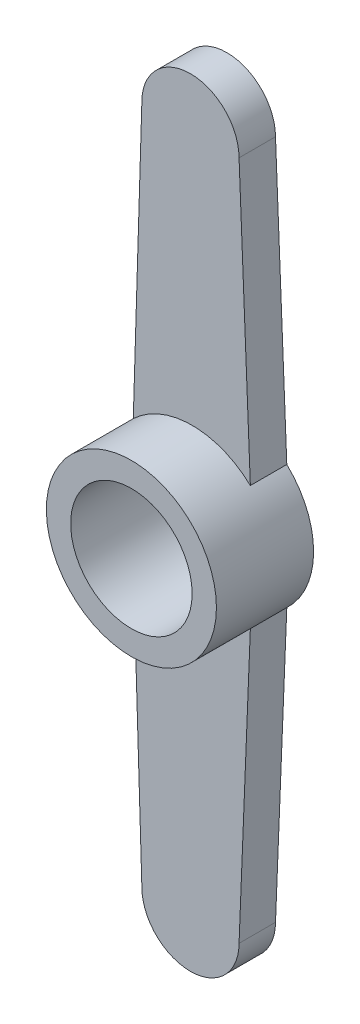
ISO-10303-21;
HEADER;
FILE_DESCRIPTION(('STEP AP214'),'2;1');
FILE_NAME('part.step','',(''),(''),'','','');
FILE_SCHEMA(('AUTOMOTIVE_DESIGN { 1 0 10303 214 1 1 1 1 }'));
ENDSEC;
DATA;
#1=APPLICATION_CONTEXT('core data for automotive mechanical design processes');
#2=APPLICATION_PROTOCOL_DEFINITION('international standard','automotive_design',2000,#1);
#3=PRODUCT_CONTEXT('',#1,'mechanical');
#4=PRODUCT('Part','Part','',(#3));
#5=PRODUCT_RELATED_PRODUCT_CATEGORY('part','',(#4));
#6=PRODUCT_DEFINITION_FORMATION('','',#4);
#7=PRODUCT_DEFINITION_CONTEXT('part definition',#1,'design');
#8=PRODUCT_DEFINITION('design','',#6,#7);
#9=PRODUCT_DEFINITION_SHAPE('','',#8);
#10=(LENGTH_UNIT() NAMED_UNIT(*) SI_UNIT(.MILLI.,.METRE.));
#11=(NAMED_UNIT(*) PLANE_ANGLE_UNIT() SI_UNIT($,.RADIAN.));
#12=(NAMED_UNIT(*) SI_UNIT($,.STERADIAN.) SOLID_ANGLE_UNIT());
#13=UNCERTAINTY_MEASURE_WITH_UNIT(LENGTH_MEASURE(1.E-05),#10,'distance_accuracy_value','');
#14=(GEOMETRIC_REPRESENTATION_CONTEXT(3) GLOBAL_UNCERTAINTY_ASSIGNED_CONTEXT((#13)) GLOBAL_UNIT_ASSIGNED_CONTEXT((#10,
#11,#12)) REPRESENTATION_CONTEXT('',''));
#15=CARTESIAN_POINT('',(0.,0.,0.));
#16=DIRECTION('',(0.,0.,1.));
#17=DIRECTION('',(1.,0.,0.));
#18=AXIS2_PLACEMENT_3D('',#15,#16,#17);
#19=CARTESIAN_POINT('',(0.,0.,4.));
#20=DIRECTION('',(0.,0.,-1.));
#21=DIRECTION('',(-1.,0.,0.));
#22=AXIS2_PLACEMENT_3D('',#19,#20,#21);
#23=CYLINDRICAL_SURFACE('',#22,3.5);
#24=CARTESIAN_POINT('',(0.,0.,4.));
#25=DIRECTION('',(0.,0.,1.));
#26=DIRECTION('',(1.,0.,0.));
#27=AXIS2_PLACEMENT_3D('',#24,#25,#26);
#28=CIRCLE('',#27,3.5);
#29=CARTESIAN_POINT('',(3.5,0.,4.));
#30=VERTEX_POINT('',#29);
#31=EDGE_CURVE('E11',#30,#30,#28,.T.);
#32=ORIENTED_EDGE('',*,*,#31,.F.);
#33=EDGE_LOOP('',(#32));
#34=FACE_BOUND('',#33,.T.);
#35=DIRECTION('',(0.,0.,-1.));
#36=VECTOR('',#35,1.);
#37=CARTESIAN_POINT('',(-2.42213608999172,-2.52651078793652,1.5));
#38=LINE('',#37,#36);
#39=CARTESIAN_POINT('',(-2.42213608999172,-2.52651078793652,1.5));
#40=VERTEX_POINT('',#39);
#41=CARTESIAN_POINT('',(-2.42213608999172,-2.52651078793652,0.));
#42=VERTEX_POINT('',#41);
#43=EDGE_CURVE('E56',#40,#42,#38,.T.);
#44=ORIENTED_EDGE('',*,*,#43,.F.);
#45=CARTESIAN_POINT('',(0.,0.,1.5));
#46=DIRECTION('',(0.,0.,1.));
#47=DIRECTION('',(1.,0.,0.));
#48=AXIS2_PLACEMENT_3D('',#45,#46,#47);
#49=CIRCLE('',#48,3.5);
#50=CARTESIAN_POINT('',(2.39640728748757,-2.55092769644231,1.5));
#51=VERTEX_POINT('',#50);
#52=EDGE_CURVE('E51',#40,#51,#49,.T.);
#53=ORIENTED_EDGE('',*,*,#52,.T.);
#54=DIRECTION('',(0.,0.,-1.));
#55=VECTOR('',#54,1.);
#56=CARTESIAN_POINT('',(2.39640728748757,-2.55092769644231,1.5));
#57=LINE('',#56,#55);
#58=CARTESIAN_POINT('',(2.39640728748757,-2.55092769644231,0.));
#59=VERTEX_POINT('',#58);
#60=EDGE_CURVE('E132',#51,#59,#57,.T.);
#61=ORIENTED_EDGE('',*,*,#60,.T.);
#62=CARTESIAN_POINT('',(0.,0.,0.));
#63=DIRECTION('',(0.,0.,1.));
#64=DIRECTION('',(1.,0.,0.));
#65=AXIS2_PLACEMENT_3D('',#62,#63,#64);
#66=CIRCLE('',#65,3.5);
#67=CARTESIAN_POINT('',(2.39640728748757,2.55092769644231,0.));
#68=VERTEX_POINT('',#67);
#69=EDGE_CURVE('E166',#59,#68,#66,.T.);
#70=ORIENTED_EDGE('',*,*,#69,.T.);
#71=DIRECTION('',(0.,0.,-1.));
#72=VECTOR('',#71,1.);
#73=CARTESIAN_POINT('',(2.39640728748757,2.55092769644231,1.5));
#74=LINE('',#73,#72);
#75=CARTESIAN_POINT('',(2.39640728748757,2.55092769644231,1.5));
#76=VERTEX_POINT('',#75);
#77=EDGE_CURVE('E146',#76,#68,#74,.T.);
#78=ORIENTED_EDGE('',*,*,#77,.F.);
#79=CARTESIAN_POINT('',(0.,0.,1.5));
#80=DIRECTION('',(0.,0.,1.));
#81=DIRECTION('',(1.,0.,0.));
#82=AXIS2_PLACEMENT_3D('',#79,#80,#81);
#83=CIRCLE('',#82,3.5);
#84=CARTESIAN_POINT('',(-2.42213608999172,2.52651078793652,1.5));
#85=VERTEX_POINT('',#84);
#86=EDGE_CURVE('E144',#76,#85,#83,.T.);
#87=ORIENTED_EDGE('',*,*,#86,.T.);
#88=DIRECTION('',(0.,0.,-1.));
#89=VECTOR('',#88,1.);
#90=CARTESIAN_POINT('',(-2.42213608999172,2.52651078793652,1.5));
#91=LINE('',#90,#89);
#92=CARTESIAN_POINT('',(-2.42213608999172,2.52651078793652,0.));
#93=VERTEX_POINT('',#92);
#94=EDGE_CURVE('E156',#85,#93,#91,.T.);
#95=ORIENTED_EDGE('',*,*,#94,.T.);
#96=EDGE_CURVE('E38',#93,#42,#66,.T.);
#97=ORIENTED_EDGE('',*,*,#96,.T.);
#98=EDGE_LOOP('',(#44,#53,#61,#70,#78,#87,#95,#97));
#99=FACE_BOUND('',#98,.T.);
#100=ADVANCED_FACE('F34',(#34,#99),#23,.T.);
#101=CARTESIAN_POINT('',(0.,0.,4.));
#102=DIRECTION('',(0.,0.,-1.));
#103=DIRECTION('',(-1.,0.,0.));
#104=AXIS2_PLACEMENT_3D('',#101,#102,#103);
#105=CYLINDRICAL_SURFACE('',#104,2.5);
#106=CARTESIAN_POINT('',(0.,0.,4.));
#107=DIRECTION('',(0.,0.,1.));
#108=DIRECTION('',(1.,0.,0.));
#109=AXIS2_PLACEMENT_3D('',#106,#107,#108);
#110=CIRCLE('',#109,2.5);
#111=CARTESIAN_POINT('',(2.5,0.,4.));
#112=VERTEX_POINT('',#111);
#113=EDGE_CURVE('E43',#112,#112,#110,.T.);
#114=ORIENTED_EDGE('',*,*,#113,.T.);
#115=EDGE_LOOP('',(#114));
#116=FACE_BOUND('',#115,.T.);
#117=CARTESIAN_POINT('',(0.,0.,0.));
#118=DIRECTION('',(0.,0.,1.));
#119=DIRECTION('',(1.,0.,0.));
#120=AXIS2_PLACEMENT_3D('',#117,#118,#119);
#121=CIRCLE('',#120,2.5);
#122=CARTESIAN_POINT('',(2.5,0.,0.));
#123=VERTEX_POINT('',#122);
#124=EDGE_CURVE('E163',#123,#123,#121,.T.);
#125=ORIENTED_EDGE('',*,*,#124,.F.);
#126=EDGE_LOOP('',(#125));
#127=FACE_BOUND('',#126,.T.);
#128=ADVANCED_FACE('F36',(#116,#127),#105,.F.);
#129=CARTESIAN_POINT('',(0.,0.,4.));
#130=DIRECTION('',(0.,0.,1.));
#131=DIRECTION('',(1.,0.,0.));
#132=AXIS2_PLACEMENT_3D('',#129,#130,#131);
#133=PLANE('',#132);
#134=ORIENTED_EDGE('',*,*,#113,.F.);
#135=EDGE_LOOP('',(#134));
#136=FACE_BOUND('',#135,.T.);
#137=ORIENTED_EDGE('',*,*,#31,.T.);
#138=EDGE_LOOP('',(#137));
#139=FACE_BOUND('',#138,.T.);
#140=ADVANCED_FACE('F190',(#136,#139),#133,.T.);
#141=CARTESIAN_POINT('',(0.,0.,0.));
#142=DIRECTION('',(0.,0.,1.));
#143=DIRECTION('',(1.,0.,0.));
#144=AXIS2_PLACEMENT_3D('',#141,#142,#143);
#145=PLANE('',#144);
#146=ORIENTED_EDGE('',*,*,#124,.T.);
#147=EDGE_LOOP('',(#146));
#148=FACE_BOUND('',#147,.T.);
#149=ORIENTED_EDGE('',*,*,#96,.F.);
#150=DIRECTION('',(0.0308041269028046,0.999525440279414,0.));
#151=VECTOR('',#150,1.);
#152=CARTESIAN_POINT('',(-2.49762776441439,0.0769737712623717,0.));
#153=LINE('',#152,#151);
#154=CARTESIAN_POINT('',(-2.0685374686224,14.,0.));
#155=VERTEX_POINT('',#154);
#156=EDGE_CURVE('E139',#93,#155,#153,.T.);
#157=ORIENTED_EDGE('',*,*,#156,.T.);
#158=CARTESIAN_POINT('',(-0.0685374686224018,14.,0.));
#159=DIRECTION('',(0.,0.,1.));
#160=DIRECTION('',(1.,0.,0.));
#161=AXIS2_PLACEMENT_3D('',#158,#159,#160);
#162=CIRCLE('',#161,2.);
#163=CARTESIAN_POINT('',(1.9314625313776,14.,0.));
#164=VERTEX_POINT('',#163);
#165=EDGE_CURVE('E149',#164,#155,#162,.T.);
#166=ORIENTED_EDGE('',*,*,#165,.F.);
#167=DIRECTION('',(0.0405763745560247,-0.999176439788234,0.));
#168=VECTOR('',#167,1.);
#169=CARTESIAN_POINT('',(2.49588389456972,0.101357393671007,0.));
#170=LINE('',#169,#168);
#171=EDGE_CURVE('E116',#164,#68,#170,.T.);
#172=ORIENTED_EDGE('',*,*,#171,.T.);
#173=ORIENTED_EDGE('',*,*,#69,.F.);
#174=DIRECTION('',(0.0405763745560247,0.999176439788234,0.));
#175=VECTOR('',#174,1.);
#176=CARTESIAN_POINT('',(2.49588389456972,-0.101357393671007,0.));
#177=LINE('',#176,#175);
#178=CARTESIAN_POINT('',(1.9314625313776,-14.,0.));
#179=VERTEX_POINT('',#178);
#180=EDGE_CURVE('E106',#179,#59,#177,.T.);
#181=ORIENTED_EDGE('',*,*,#180,.F.);
#182=CARTESIAN_POINT('',(-0.0685374686224018,-14.,0.));
#183=DIRECTION('',(0.,0.,1.));
#184=DIRECTION('',(1.,0.,0.));
#185=AXIS2_PLACEMENT_3D('',#182,#183,#184);
#186=CIRCLE('',#185,2.);
#187=CARTESIAN_POINT('',(-2.0685374686224,-14.,0.));
#188=VERTEX_POINT('',#187);
#189=EDGE_CURVE('E127',#179,#188,#186,.F.);
#190=ORIENTED_EDGE('',*,*,#189,.T.);
#191=DIRECTION('',(0.0308041269028046,-0.999525440279414,0.));
#192=VECTOR('',#191,1.);
#193=CARTESIAN_POINT('',(-2.49762776441439,-0.0769737712623717,0.));
#194=LINE('',#193,#192);
#195=EDGE_CURVE('E112',#42,#188,#194,.T.);
#196=ORIENTED_EDGE('',*,*,#195,.F.);
#197=EDGE_LOOP('',(#149,#157,#166,#172,#173,#181,#190,#196));
#198=FACE_BOUND('',#197,.T.);
#199=ADVANCED_FACE('F172',(#148,#198),#145,.F.);
#200=CARTESIAN_POINT('',(2.49588389456972,0.101357393671007,1.5));
#201=DIRECTION('',(0.999176439788233,0.0405763745560247,0.));
#202=DIRECTION('',(-0.0405763745560247,0.999176439788234,0.));
#203=AXIS2_PLACEMENT_3D('',#200,#201,#202);
#204=PLANE('',#203);
#205=ORIENTED_EDGE('',*,*,#171,.F.);
#206=DIRECTION('',(0.,0.,-1.));
#207=VECTOR('',#206,1.);
#208=CARTESIAN_POINT('',(1.9314625313776,14.,1.5));
#209=LINE('',#208,#207);
#210=CARTESIAN_POINT('',(1.9314625313776,14.,1.5));
#211=VERTEX_POINT('',#210);
#212=EDGE_CURVE('E161',#211,#164,#209,.T.);
#213=ORIENTED_EDGE('',*,*,#212,.F.);
#214=DIRECTION('',(0.0405763745560247,-0.999176439788234,0.));
#215=VECTOR('',#214,1.);
#216=CARTESIAN_POINT('',(2.49588389456972,0.101357393671007,1.5));
#217=LINE('',#216,#215);
#218=EDGE_CURVE('E135',#211,#76,#217,.T.);
#219=ORIENTED_EDGE('',*,*,#218,.T.);
#220=ORIENTED_EDGE('',*,*,#77,.T.);
#221=EDGE_LOOP('',(#205,#213,#219,#220));
#222=FACE_BOUND('',#221,.T.);
#223=ADVANCED_FACE('F196',(#222),#204,.T.);
#224=CARTESIAN_POINT('',(-0.0685374686224018,14.,1.5));
#225=DIRECTION('',(0.,0.,-1.));
#226=DIRECTION('',(-1.,0.,0.));
#227=AXIS2_PLACEMENT_3D('',#224,#225,#226);
#228=CYLINDRICAL_SURFACE('',#227,2.);
#229=ORIENTED_EDGE('',*,*,#165,.T.);
#230=DIRECTION('',(0.,0.,-1.));
#231=VECTOR('',#230,1.);
#232=CARTESIAN_POINT('',(-2.0685374686224,14.,1.5));
#233=LINE('',#232,#231);
#234=CARTESIAN_POINT('',(-2.0685374686224,14.,1.5));
#235=VERTEX_POINT('',#234);
#236=EDGE_CURVE('E159',#235,#155,#233,.T.);
#237=ORIENTED_EDGE('',*,*,#236,.F.);
#238=CARTESIAN_POINT('',(-0.0685374686224018,14.,1.5));
#239=DIRECTION('',(0.,0.,1.));
#240=DIRECTION('',(1.,0.,0.));
#241=AXIS2_PLACEMENT_3D('',#238,#239,#240);
#242=CIRCLE('',#241,2.);
#243=EDGE_CURVE('E138',#211,#235,#242,.T.);
#244=ORIENTED_EDGE('',*,*,#243,.F.);
#245=ORIENTED_EDGE('',*,*,#212,.T.);
#246=EDGE_LOOP('',(#229,#237,#244,#245));
#247=FACE_BOUND('',#246,.T.);
#248=ADVANCED_FACE('F202',(#247),#228,.T.);
#249=CARTESIAN_POINT('',(-2.49762776441439,0.0769737712623717,1.5));
#250=DIRECTION('',(-0.999525440279414,0.0308041269028046,0.));
#251=DIRECTION('',(-0.0308041269028046,-0.999525440279414,0.));
#252=AXIS2_PLACEMENT_3D('',#249,#250,#251);
#253=PLANE('',#252);
#254=ORIENTED_EDGE('',*,*,#156,.F.);
#255=ORIENTED_EDGE('',*,*,#94,.F.);
#256=DIRECTION('',(0.0308041269028046,0.999525440279414,0.));
#257=VECTOR('',#256,1.);
#258=CARTESIAN_POINT('',(-2.49762776441439,0.0769737712623717,1.5));
#259=LINE('',#258,#257);
#260=EDGE_CURVE('E141',#85,#235,#259,.T.);
#261=ORIENTED_EDGE('',*,*,#260,.T.);
#262=ORIENTED_EDGE('',*,*,#236,.T.);
#263=EDGE_LOOP('',(#254,#255,#261,#262));
#264=FACE_BOUND('',#263,.T.);
#265=ADVANCED_FACE('F206',(#264),#253,.T.);
#266=CARTESIAN_POINT('',(0.,0.,1.5));
#267=DIRECTION('',(0.,0.,1.));
#268=DIRECTION('',(1.,0.,0.));
#269=AXIS2_PLACEMENT_3D('',#266,#267,#268);
#270=PLANE('',#269);
#271=ORIENTED_EDGE('',*,*,#218,.F.);
#272=ORIENTED_EDGE('',*,*,#243,.T.);
#273=ORIENTED_EDGE('',*,*,#260,.F.);
#274=ORIENTED_EDGE('',*,*,#86,.F.);
#275=EDGE_LOOP('',(#271,#272,#273,#274));
#276=FACE_BOUND('',#275,.T.);
#277=ADVANCED_FACE('F210',(#276),#270,.T.);
#278=CARTESIAN_POINT('',(-2.49762776441439,-0.0769737712623717,1.5));
#279=DIRECTION('',(0.999525440279414,0.0308041269028046,0.));
#280=DIRECTION('',(-0.0308041269028046,0.999525440279414,0.));
#281=AXIS2_PLACEMENT_3D('',#278,#279,#280);
#282=PLANE('',#281);
#283=ORIENTED_EDGE('',*,*,#195,.T.);
#284=DIRECTION('',(0.,0.,-1.));
#285=VECTOR('',#284,1.);
#286=CARTESIAN_POINT('',(-2.0685374686224,-14.,1.5));
#287=LINE('',#286,#285);
#288=CARTESIAN_POINT('',(-2.0685374686224,-14.,1.5));
#289=VERTEX_POINT('',#288);
#290=EDGE_CURVE('E109',#289,#188,#287,.T.);
#291=ORIENTED_EDGE('',*,*,#290,.F.);
#292=DIRECTION('',(0.0308041269028046,-0.999525440279414,0.));
#293=VECTOR('',#292,1.);
#294=CARTESIAN_POINT('',(-2.49762776441439,-0.0769737712623717,1.5));
#295=LINE('',#294,#293);
#296=EDGE_CURVE('E100',#40,#289,#295,.T.);
#297=ORIENTED_EDGE('',*,*,#296,.F.);
#298=ORIENTED_EDGE('',*,*,#43,.T.);
#299=EDGE_LOOP('',(#283,#291,#297,#298));
#300=FACE_BOUND('',#299,.T.);
#301=ADVANCED_FACE('F110',(#300),#282,.F.);
#302=CARTESIAN_POINT('',(-0.0685374686224018,-14.,1.5));
#303=DIRECTION('',(0.,0.,-1.));
#304=DIRECTION('',(-1.,0.,0.));
#305=AXIS2_PLACEMENT_3D('',#302,#303,#304);
#306=CYLINDRICAL_SURFACE('',#305,2.);
#307=ORIENTED_EDGE('',*,*,#189,.F.);
#308=DIRECTION('',(0.,0.,-1.));
#309=VECTOR('',#308,1.);
#310=CARTESIAN_POINT('',(1.9314625313776,-14.,1.5));
#311=LINE('',#310,#309);
#312=CARTESIAN_POINT('',(1.9314625313776,-14.,1.5));
#313=VERTEX_POINT('',#312);
#314=EDGE_CURVE('E117',#313,#179,#311,.T.);
#315=ORIENTED_EDGE('',*,*,#314,.F.);
#316=CARTESIAN_POINT('',(-0.0685374686224018,-14.,1.5));
#317=DIRECTION('',(0.,0.,1.));
#318=DIRECTION('',(1.,0.,0.));
#319=AXIS2_PLACEMENT_3D('',#316,#317,#318);
#320=CIRCLE('',#319,2.);
#321=EDGE_CURVE('E104',#313,#289,#320,.F.);
#322=ORIENTED_EDGE('',*,*,#321,.T.);
#323=ORIENTED_EDGE('',*,*,#290,.T.);
#324=EDGE_LOOP('',(#307,#315,#322,#323));
#325=FACE_BOUND('',#324,.T.);
#326=ADVANCED_FACE('F119',(#325),#306,.T.);
#327=CARTESIAN_POINT('',(2.49588389456972,-0.101357393671007,1.5));
#328=DIRECTION('',(-0.999176439788233,0.0405763745560247,0.));
#329=DIRECTION('',(-0.0405763745560247,-0.999176439788234,0.));
#330=AXIS2_PLACEMENT_3D('',#327,#328,#329);
#331=PLANE('',#330);
#332=ORIENTED_EDGE('',*,*,#180,.T.);
#333=ORIENTED_EDGE('',*,*,#60,.F.);
#334=DIRECTION('',(0.0405763745560247,0.999176439788234,0.));
#335=VECTOR('',#334,1.);
#336=CARTESIAN_POINT('',(2.49588389456972,-0.101357393671007,1.5));
#337=LINE('',#336,#335);
#338=EDGE_CURVE('E121',#313,#51,#337,.T.);
#339=ORIENTED_EDGE('',*,*,#338,.F.);
#340=ORIENTED_EDGE('',*,*,#314,.T.);
#341=EDGE_LOOP('',(#332,#333,#339,#340));
#342=FACE_BOUND('',#341,.T.);
#343=ADVANCED_FACE('F176',(#342),#331,.F.);
#344=CARTESIAN_POINT('',(0.,0.,1.5));
#345=DIRECTION('',(0.,0.,1.));
#346=DIRECTION('',(1.,0.,0.));
#347=AXIS2_PLACEMENT_3D('',#344,#345,#346);
#348=PLANE('',#347);
#349=ORIENTED_EDGE('',*,*,#296,.T.);
#350=ORIENTED_EDGE('',*,*,#321,.F.);
#351=ORIENTED_EDGE('',*,*,#338,.T.);
#352=ORIENTED_EDGE('',*,*,#52,.F.);
#353=EDGE_LOOP('',(#349,#350,#351,#352));
#354=FACE_BOUND('',#353,.T.);
#355=ADVANCED_FACE('F102',(#354),#348,.T.);
#356=CLOSED_SHELL('',(#100,#128,#140,#199,#223,#248,#265,#277,#301,#326,#343,#355));
#357=MANIFOLD_SOLID_BREP('B2',#356);
#358=ADVANCED_BREP_SHAPE_REPRESENTATION('',(#18,#357),#14);
#359=SHAPE_DEFINITION_REPRESENTATION(#9,#358);
ENDSEC;
END-ISO-10303-21;
